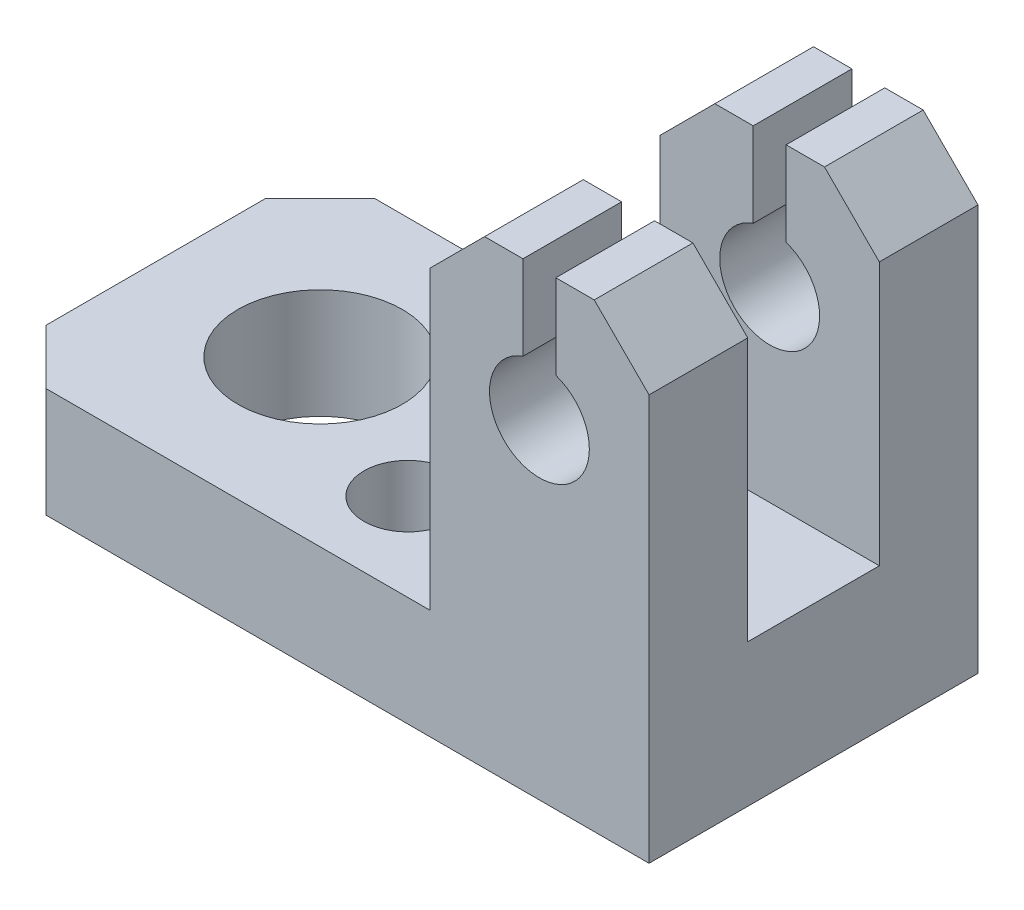
ISO-10303-21;
HEADER;
FILE_DESCRIPTION(('STEP AP214'),'2;1');
FILE_NAME('part.step','',(''),(''),'','','');
FILE_SCHEMA(('AUTOMOTIVE_DESIGN { 1 0 10303 214 1 1 1 1 }'));
ENDSEC;
DATA;
#1=APPLICATION_CONTEXT('core data for automotive mechanical design processes');
#2=APPLICATION_PROTOCOL_DEFINITION('international standard','automotive_design',2000,#1);
#3=PRODUCT_CONTEXT('',#1,'mechanical');
#4=PRODUCT('Part','Part','',(#3));
#5=PRODUCT_RELATED_PRODUCT_CATEGORY('part','',(#4));
#6=PRODUCT_DEFINITION_FORMATION('','',#4);
#7=PRODUCT_DEFINITION_CONTEXT('part definition',#1,'design');
#8=PRODUCT_DEFINITION('design','',#6,#7);
#9=PRODUCT_DEFINITION_SHAPE('','',#8);
#10=(LENGTH_UNIT() NAMED_UNIT(*) SI_UNIT(.MILLI.,.METRE.));
#11=(NAMED_UNIT(*) PLANE_ANGLE_UNIT() SI_UNIT($,.RADIAN.));
#12=(NAMED_UNIT(*) SI_UNIT($,.STERADIAN.) SOLID_ANGLE_UNIT());
#13=UNCERTAINTY_MEASURE_WITH_UNIT(LENGTH_MEASURE(1.E-05),#10,'distance_accuracy_value','');
#14=(GEOMETRIC_REPRESENTATION_CONTEXT(3) GLOBAL_UNCERTAINTY_ASSIGNED_CONTEXT((#13)) GLOBAL_UNIT_ASSIGNED_CONTEXT((#10,
#11,#12)) REPRESENTATION_CONTEXT('',''));
#15=CARTESIAN_POINT('',(0.,0.,0.));
#16=DIRECTION('',(0.,0.,1.));
#17=DIRECTION('',(1.,0.,0.));
#18=AXIS2_PLACEMENT_3D('',#15,#16,#17);
#19=CARTESIAN_POINT('',(-10.,30.,30.));
#20=DIRECTION('',(0.,0.,-1.));
#21=DIRECTION('',(-1.,0.,0.));
#22=AXIS2_PLACEMENT_3D('',#19,#20,#21);
#23=CYLINDRICAL_SURFACE('',#22,4.55349178710825);
#24=CARTESIAN_POINT('',(-10.,30.,9.));
#25=DIRECTION('',(0.,0.,-1.));
#26=DIRECTION('',(0.,1.,0.));
#27=AXIS2_PLACEMENT_3D('',#24,#25,#26);
#28=CIRCLE('',#27,4.55349178710825);
#29=CARTESIAN_POINT('',(-8.5,34.2993356992985,9.));
#30=VERTEX_POINT('',#29);
#31=CARTESIAN_POINT('',(-11.5,34.2993356992985,9.));
#32=VERTEX_POINT('',#31);
#33=EDGE_CURVE('E270',#30,#32,#28,.T.);
#34=ORIENTED_EDGE('',*,*,#33,.F.);
#35=DIRECTION('',(0.,0.,-1.));
#36=VECTOR('',#35,1.);
#37=CARTESIAN_POINT('',(-8.5,34.2993356992985,30.));
#38=LINE('',#37,#36);
#39=CARTESIAN_POINT('',(-8.5,34.2993356992985,0.));
#40=VERTEX_POINT('',#39);
#41=EDGE_CURVE('E336',#30,#40,#38,.T.);
#42=ORIENTED_EDGE('',*,*,#41,.T.);
#43=CARTESIAN_POINT('',(-10.,30.,0.));
#44=DIRECTION('',(0.,0.,1.));
#45=DIRECTION('',(1.,0.,0.));
#46=AXIS2_PLACEMENT_3D('',#43,#44,#45);
#47=CIRCLE('',#46,4.55349178710825);
#48=CARTESIAN_POINT('',(-11.5,34.2993356992985,0.));
#49=VERTEX_POINT('',#48);
#50=EDGE_CURVE('E281',#49,#40,#47,.T.);
#51=ORIENTED_EDGE('',*,*,#50,.F.);
#52=DIRECTION('',(0.,0.,-1.));
#53=VECTOR('',#52,1.);
#54=CARTESIAN_POINT('',(-11.5,34.2993356992985,30.));
#55=LINE('',#54,#53);
#56=EDGE_CURVE('E395',#32,#49,#55,.T.);
#57=ORIENTED_EDGE('',*,*,#56,.F.);
#58=EDGE_LOOP('',(#34,#42,#51,#57));
#59=FACE_BOUND('',#58,.T.);
#60=ADVANCED_FACE('F49',(#59),#23,.F.);
#61=CARTESIAN_POINT('',(-11.5,0.,30.));
#62=DIRECTION('',(1.,0.,0.));
#63=DIRECTION('',(0.,1.,0.));
#64=AXIS2_PLACEMENT_3D('',#61,#62,#63);
#65=PLANE('',#64);
#66=DIRECTION('',(0.,1.,0.));
#67=VECTOR('',#66,1.);
#68=CARTESIAN_POINT('',(-11.5,0.,9.00000000000001));
#69=LINE('',#68,#67);
#70=CARTESIAN_POINT('',(-11.5,42.,9.));
#71=VERTEX_POINT('',#70);
#72=EDGE_CURVE('E273',#32,#71,#69,.T.);
#73=ORIENTED_EDGE('',*,*,#72,.F.);
#74=ORIENTED_EDGE('',*,*,#56,.T.);
#75=DIRECTION('',(0.,-1.,0.));
#76=VECTOR('',#75,1.);
#77=CARTESIAN_POINT('',(-11.5,0.,0.));
#78=LINE('',#77,#76);
#79=CARTESIAN_POINT('',(-11.5,42.,0.));
#80=VERTEX_POINT('',#79);
#81=EDGE_CURVE('E340',#80,#49,#78,.T.);
#82=ORIENTED_EDGE('',*,*,#81,.F.);
#83=DIRECTION('',(0.,0.,-1.));
#84=VECTOR('',#83,1.);
#85=CARTESIAN_POINT('',(-11.5,42.,30.));
#86=LINE('',#85,#84);
#87=EDGE_CURVE('E390',#71,#80,#86,.T.);
#88=ORIENTED_EDGE('',*,*,#87,.F.);
#89=EDGE_LOOP('',(#73,#74,#82,#88));
#90=FACE_BOUND('',#89,.T.);
#91=ADVANCED_FACE('F567',(#90),#65,.T.);
#92=CARTESIAN_POINT('',(0.,42.,30.));
#93=DIRECTION('',(0.,-1.,0.));
#94=DIRECTION('',(0.,0.,-1.));
#95=AXIS2_PLACEMENT_3D('',#92,#93,#94);
#96=PLANE('',#95);
#97=DIRECTION('',(-1.,0.,0.));
#98=VECTOR('',#97,1.);
#99=CARTESIAN_POINT('',(0.,42.,0.));
#100=LINE('',#99,#98);
#101=CARTESIAN_POINT('',(-15.,42.,0.));
#102=VERTEX_POINT('',#101);
#103=EDGE_CURVE('E344',#80,#102,#100,.T.);
#104=ORIENTED_EDGE('',*,*,#103,.T.);
#105=DIRECTION('',(0.,0.,1.));
#106=VECTOR('',#105,1.);
#107=CARTESIAN_POINT('',(-15.,42.,9.));
#108=LINE('',#107,#106);
#109=CARTESIAN_POINT('',(-15.,42.,9.));
#110=VERTEX_POINT('',#109);
#111=EDGE_CURVE('E463',#102,#110,#108,.T.);
#112=ORIENTED_EDGE('',*,*,#111,.T.);
#113=DIRECTION('',(-1.,0.,0.));
#114=VECTOR('',#113,1.);
#115=CARTESIAN_POINT('',(0.,42.,9.));
#116=LINE('',#115,#114);
#117=EDGE_CURVE('E258',#71,#110,#116,.T.);
#118=ORIENTED_EDGE('',*,*,#117,.F.);
#119=ORIENTED_EDGE('',*,*,#87,.T.);
#120=EDGE_LOOP('',(#104,#112,#118,#119));
#121=FACE_BOUND('',#120,.T.);
#122=ADVANCED_FACE('F545',(#121),#96,.F.);
#123=CARTESIAN_POINT('',(0.,42.,30.));
#124=DIRECTION('',(0.,-1.,0.));
#125=DIRECTION('',(0.,0.,-1.));
#126=AXIS2_PLACEMENT_3D('',#123,#124,#125);
#127=PLANE('',#126);
#128=CARTESIAN_POINT('',(-5.,42.,9.));
#129=VERTEX_POINT('',#128);
#130=CARTESIAN_POINT('',(-8.5,42.,9.));
#131=VERTEX_POINT('',#130);
#132=EDGE_CURVE('E254',#129,#131,#116,.T.);
#133=ORIENTED_EDGE('',*,*,#132,.F.);
#134=DIRECTION('',(0.,0.,-1.));
#135=VECTOR('',#134,1.);
#136=CARTESIAN_POINT('',(-5.,42.,30.));
#137=LINE('',#136,#135);
#138=CARTESIAN_POINT('',(-5.,42.,0.));
#139=VERTEX_POINT('',#138);
#140=EDGE_CURVE('E408',#129,#139,#137,.T.);
#141=ORIENTED_EDGE('',*,*,#140,.T.);
#142=DIRECTION('',(-1.,0.,0.));
#143=VECTOR('',#142,1.);
#144=CARTESIAN_POINT('',(0.,42.,0.));
#145=LINE('',#144,#143);
#146=CARTESIAN_POINT('',(-8.5,42.,0.));
#147=VERTEX_POINT('',#146);
#148=EDGE_CURVE('E362',#139,#147,#145,.T.);
#149=ORIENTED_EDGE('',*,*,#148,.T.);
#150=DIRECTION('',(0.,0.,-1.));
#151=VECTOR('',#150,1.);
#152=CARTESIAN_POINT('',(-8.5,42.,30.));
#153=LINE('',#152,#151);
#154=EDGE_CURVE('E372',#131,#147,#153,.T.);
#155=ORIENTED_EDGE('',*,*,#154,.F.);
#156=EDGE_LOOP('',(#133,#141,#149,#155));
#157=FACE_BOUND('',#156,.T.);
#158=ADVANCED_FACE('F568',(#157),#127,.F.);
#159=CARTESIAN_POINT('',(-8.49999999999999,0.,30.));
#160=DIRECTION('',(1.,0.,0.));
#161=DIRECTION('',(0.,1.,0.));
#162=AXIS2_PLACEMENT_3D('',#159,#160,#161);
#163=PLANE('',#162);
#164=ORIENTED_EDGE('',*,*,#41,.F.);
#165=DIRECTION('',(0.,1.,0.));
#166=VECTOR('',#165,1.);
#167=CARTESIAN_POINT('',(-8.49999999999999,0.,9.00000000000001));
#168=LINE('',#167,#166);
#169=EDGE_CURVE('E404',#30,#131,#168,.T.);
#170=ORIENTED_EDGE('',*,*,#169,.T.);
#171=ORIENTED_EDGE('',*,*,#154,.T.);
#172=DIRECTION('',(0.,-1.,0.));
#173=VECTOR('',#172,1.);
#174=CARTESIAN_POINT('',(-8.49999999999999,0.,0.));
#175=LINE('',#174,#173);
#176=EDGE_CURVE('E306',#147,#40,#175,.T.);
#177=ORIENTED_EDGE('',*,*,#176,.T.);
#178=EDGE_LOOP('',(#164,#170,#171,#177));
#179=FACE_BOUND('',#178,.T.);
#180=ADVANCED_FACE('F560',(#179),#163,.F.);
#181=CARTESIAN_POINT('',(-10.,30.,21.));
#182=DIRECTION('',(0.,0.,1.));
#183=DIRECTION('',(0.,-1.,0.));
#184=AXIS2_PLACEMENT_3D('',#181,#182,#183);
#185=CIRCLE('',#184,4.55349178710825);
#186=CARTESIAN_POINT('',(-11.5,34.2993356992985,21.));
#187=VERTEX_POINT('',#186);
#188=CARTESIAN_POINT('',(-8.5,34.2993356992985,21.));
#189=VERTEX_POINT('',#188);
#190=EDGE_CURVE('E257',#187,#189,#185,.T.);
#191=ORIENTED_EDGE('',*,*,#190,.F.);
#192=CARTESIAN_POINT('',(-11.5,34.2993356992985,30.));
#193=VERTEX_POINT('',#192);
#194=EDGE_CURVE('E396',#193,#187,#55,.T.);
#195=ORIENTED_EDGE('',*,*,#194,.F.);
#196=CARTESIAN_POINT('',(-10.,30.,30.));
#197=DIRECTION('',(0.,0.,1.));
#198=DIRECTION('',(1.,0.,0.));
#199=AXIS2_PLACEMENT_3D('',#196,#197,#198);
#200=CIRCLE('',#199,4.55349178710825);
#201=CARTESIAN_POINT('',(-8.5,34.2993356992985,30.));
#202=VERTEX_POINT('',#201);
#203=EDGE_CURVE('E301',#193,#202,#200,.T.);
#204=ORIENTED_EDGE('',*,*,#203,.T.);
#205=EDGE_CURVE('E368',#202,#189,#38,.T.);
#206=ORIENTED_EDGE('',*,*,#205,.T.);
#207=EDGE_LOOP('',(#191,#195,#204,#206));
#208=FACE_BOUND('',#207,.T.);
#209=ADVANCED_FACE('F558',(#208),#23,.F.);
#210=DIRECTION('',(0.,-1.,0.));
#211=VECTOR('',#210,1.);
#212=CARTESIAN_POINT('',(-11.5,0.,21.));
#213=LINE('',#212,#211);
#214=CARTESIAN_POINT('',(-11.5,42.,21.));
#215=VERTEX_POINT('',#214);
#216=EDGE_CURVE('E267',#215,#187,#213,.T.);
#217=ORIENTED_EDGE('',*,*,#216,.F.);
#218=CARTESIAN_POINT('',(-11.5,42.,30.));
#219=VERTEX_POINT('',#218);
#220=EDGE_CURVE('E391',#219,#215,#86,.T.);
#221=ORIENTED_EDGE('',*,*,#220,.F.);
#222=DIRECTION('',(0.,-1.,0.));
#223=VECTOR('',#222,1.);
#224=CARTESIAN_POINT('',(-11.5,0.,30.));
#225=LINE('',#224,#223);
#226=EDGE_CURVE('E305',#219,#193,#225,.T.);
#227=ORIENTED_EDGE('',*,*,#226,.T.);
#228=ORIENTED_EDGE('',*,*,#194,.T.);
#229=EDGE_LOOP('',(#217,#221,#227,#228));
#230=FACE_BOUND('',#229,.T.);
#231=ADVANCED_FACE('F523',(#230),#65,.T.);
#232=DIRECTION('',(-1.,0.,0.));
#233=VECTOR('',#232,1.);
#234=CARTESIAN_POINT('',(0.,42.,21.));
#235=LINE('',#234,#233);
#236=CARTESIAN_POINT('',(-15.,42.,21.));
#237=VERTEX_POINT('',#236);
#238=EDGE_CURVE('E262',#215,#237,#235,.T.);
#239=ORIENTED_EDGE('',*,*,#238,.T.);
#240=DIRECTION('',(0.,0.,1.));
#241=VECTOR('',#240,1.);
#242=CARTESIAN_POINT('',(-15.,42.,30.));
#243=LINE('',#242,#241);
#244=CARTESIAN_POINT('',(-15.,42.,30.));
#245=VERTEX_POINT('',#244);
#246=EDGE_CURVE('E460',#237,#245,#243,.T.);
#247=ORIENTED_EDGE('',*,*,#246,.T.);
#248=DIRECTION('',(-1.,0.,0.));
#249=VECTOR('',#248,1.);
#250=CARTESIAN_POINT('',(0.,42.,30.));
#251=LINE('',#250,#249);
#252=EDGE_CURVE('E310',#219,#245,#251,.T.);
#253=ORIENTED_EDGE('',*,*,#252,.F.);
#254=ORIENTED_EDGE('',*,*,#220,.T.);
#255=EDGE_LOOP('',(#239,#247,#253,#254));
#256=FACE_BOUND('',#255,.T.);
#257=ADVANCED_FACE('F527',(#256),#96,.F.);
#258=CARTESIAN_POINT('',(-20.,0.,30.));
#259=DIRECTION('',(-1.,0.,0.));
#260=DIRECTION('',(0.,-1.,0.));
#261=AXIS2_PLACEMENT_3D('',#258,#259,#260);
#262=PLANE('',#261);
#263=DIRECTION('',(0.,1.,0.));
#264=VECTOR('',#263,1.);
#265=CARTESIAN_POINT('',(-20.,0.,30.));
#266=LINE('',#265,#264);
#267=CARTESIAN_POINT('',(-20.,10.,30.));
#268=VERTEX_POINT('',#267);
#269=CARTESIAN_POINT('',(-20.,37.,30.));
#270=VERTEX_POINT('',#269);
#271=EDGE_CURVE('E314',#268,#270,#266,.T.);
#272=ORIENTED_EDGE('',*,*,#271,.T.);
#273=DIRECTION('',(0.,0.,-1.));
#274=VECTOR('',#273,1.);
#275=CARTESIAN_POINT('',(-20.,37.,21.));
#276=LINE('',#275,#274);
#277=CARTESIAN_POINT('',(-20.,37.,21.));
#278=VERTEX_POINT('',#277);
#279=EDGE_CURVE('E456',#270,#278,#276,.T.);
#280=ORIENTED_EDGE('',*,*,#279,.T.);
#281=DIRECTION('',(0.,1.,0.));
#282=VECTOR('',#281,1.);
#283=CARTESIAN_POINT('',(-20.,42.,21.));
#284=LINE('',#283,#282);
#285=CARTESIAN_POINT('',(-20.,13.,21.));
#286=VERTEX_POINT('',#285);
#287=EDGE_CURVE('E225',#286,#278,#284,.T.);
#288=ORIENTED_EDGE('',*,*,#287,.F.);
#289=DIRECTION('',(0.,0.,1.));
#290=VECTOR('',#289,1.);
#291=CARTESIAN_POINT('',(-20.,13.,9.));
#292=LINE('',#291,#290);
#293=CARTESIAN_POINT('',(-20.,13.,9.));
#294=VERTEX_POINT('',#293);
#295=EDGE_CURVE('E248',#294,#286,#292,.T.);
#296=ORIENTED_EDGE('',*,*,#295,.F.);
#297=DIRECTION('',(0.,-1.,0.));
#298=VECTOR('',#297,1.);
#299=CARTESIAN_POINT('',(-20.,42.,9.));
#300=LINE('',#299,#298);
#301=CARTESIAN_POINT('',(-20.,37.,9.));
#302=VERTEX_POINT('',#301);
#303=EDGE_CURVE('E231',#302,#294,#300,.T.);
#304=ORIENTED_EDGE('',*,*,#303,.F.);
#305=DIRECTION('',(0.,0.,-1.));
#306=VECTOR('',#305,1.);
#307=CARTESIAN_POINT('',(-20.,37.,0.));
#308=LINE('',#307,#306);
#309=CARTESIAN_POINT('',(-20.,37.,0.));
#310=VERTEX_POINT('',#309);
#311=EDGE_CURVE('E452',#302,#310,#308,.T.);
#312=ORIENTED_EDGE('',*,*,#311,.T.);
#313=DIRECTION('',(0.,1.,0.));
#314=VECTOR('',#313,1.);
#315=CARTESIAN_POINT('',(-20.,0.,0.));
#316=LINE('',#315,#314);
#317=CARTESIAN_POINT('',(-20.,10.,0.));
#318=VERTEX_POINT('',#317);
#319=EDGE_CURVE('E348',#318,#310,#316,.T.);
#320=ORIENTED_EDGE('',*,*,#319,.F.);
#321=DIRECTION('',(0.,0.,-1.));
#322=VECTOR('',#321,1.);
#323=CARTESIAN_POINT('',(-20.,10.,30.));
#324=LINE('',#323,#322);
#325=EDGE_CURVE('E387',#268,#318,#324,.T.);
#326=ORIENTED_EDGE('',*,*,#325,.F.);
#327=EDGE_LOOP('',(#272,#280,#288,#296,#304,#312,#320,#326));
#328=FACE_BOUND('',#327,.T.);
#329=ADVANCED_FACE('F535',(#328),#262,.T.);
#330=CARTESIAN_POINT('',(0.,10.,30.));
#331=DIRECTION('',(0.,-1.,0.));
#332=DIRECTION('',(1.,0.,0.));
#333=AXIS2_PLACEMENT_3D('',#330,#331,#332);
#334=PLANE('',#333);
#335=CARTESIAN_POINT('',(-45.,9.99999999999999,15.));
#336=DIRECTION('',(0.,1.,0.));
#337=DIRECTION('',(-1.,0.,0.));
#338=AXIS2_PLACEMENT_3D('',#335,#336,#337);
#339=CIRCLE('',#338,7.5);
#340=CARTESIAN_POINT('',(-52.5,9.99999999999999,15.));
#341=VERTEX_POINT('',#340);
#342=EDGE_CURVE('E282',#341,#341,#339,.T.);
#343=ORIENTED_EDGE('',*,*,#342,.F.);
#344=EDGE_LOOP('',(#343));
#345=FACE_BOUND('',#344,.T.);
#346=CARTESIAN_POINT('',(-30.,9.99999999999999,8.));
#347=DIRECTION('',(0.,1.,0.));
#348=DIRECTION('',(-1.,0.,0.));
#349=AXIS2_PLACEMENT_3D('',#346,#347,#348);
#350=CIRCLE('',#349,4.);
#351=CARTESIAN_POINT('',(-34.,9.99999999999999,8.));
#352=VERTEX_POINT('',#351);
#353=EDGE_CURVE('E286',#352,#352,#350,.T.);
#354=ORIENTED_EDGE('',*,*,#353,.F.);
#355=EDGE_LOOP('',(#354));
#356=FACE_BOUND('',#355,.T.);
#357=CARTESIAN_POINT('',(-30.,9.99999999999999,22.));
#358=DIRECTION('',(0.,1.,0.));
#359=DIRECTION('',(-1.,0.,0.));
#360=AXIS2_PLACEMENT_3D('',#357,#358,#359);
#361=CIRCLE('',#360,4.);
#362=CARTESIAN_POINT('',(-34.,9.99999999999999,22.));
#363=VERTEX_POINT('',#362);
#364=EDGE_CURVE('E294',#363,#363,#361,.T.);
#365=ORIENTED_EDGE('',*,*,#364,.F.);
#366=EDGE_LOOP('',(#365));
#367=FACE_BOUND('',#366,.T.);
#368=DIRECTION('',(0.,0.,-1.));
#369=VECTOR('',#368,1.);
#370=CARTESIAN_POINT('',(-60.,9.99999999999999,30.));
#371=LINE('',#370,#369);
#372=CARTESIAN_POINT('',(-60.,9.99999999999999,25.));
#373=VERTEX_POINT('',#372);
#374=CARTESIAN_POINT('',(-60.,9.99999999999999,5.00000000000001));
#375=VERTEX_POINT('',#374);
#376=EDGE_CURVE('E384',#373,#375,#371,.T.);
#377=ORIENTED_EDGE('',*,*,#376,.F.);
#378=DIRECTION('',(-0.707106781186549,0.,-0.707106781186546));
#379=VECTOR('',#378,1.);
#380=CARTESIAN_POINT('',(-60.,9.99999999999999,25.));
#381=LINE('',#380,#379);
#382=CARTESIAN_POINT('',(-55.,9.99999999999999,30.));
#383=VERTEX_POINT('',#382);
#384=EDGE_CURVE('E74',#373,#383,#381,.F.);
#385=ORIENTED_EDGE('',*,*,#384,.T.);
#386=DIRECTION('',(-1.,0.,0.));
#387=VECTOR('',#386,1.);
#388=CARTESIAN_POINT('',(0.,10.,30.));
#389=LINE('',#388,#387);
#390=EDGE_CURVE('E318',#268,#383,#389,.T.);
#391=ORIENTED_EDGE('',*,*,#390,.F.);
#392=ORIENTED_EDGE('',*,*,#325,.T.);
#393=DIRECTION('',(-1.,0.,0.));
#394=VECTOR('',#393,1.);
#395=CARTESIAN_POINT('',(0.,10.,0.));
#396=LINE('',#395,#394);
#397=CARTESIAN_POINT('',(-55.,9.99999999999999,0.));
#398=VERTEX_POINT('',#397);
#399=EDGE_CURVE('E352',#318,#398,#396,.T.);
#400=ORIENTED_EDGE('',*,*,#399,.T.);
#401=DIRECTION('',(-0.707106781186546,0.,0.707106781186549));
#402=VECTOR('',#401,1.);
#403=CARTESIAN_POINT('',(-55.,9.99999999999999,0.));
#404=LINE('',#403,#402);
#405=EDGE_CURVE('E66',#398,#375,#404,.T.);
#406=ORIENTED_EDGE('',*,*,#405,.T.);
#407=EDGE_LOOP('',(#377,#385,#391,#392,#400,#406));
#408=FACE_BOUND('',#407,.T.);
#409=ADVANCED_FACE('F491',(#345,#356,#367,#408),#334,.F.);
#410=CARTESIAN_POINT('',(-60.,0.,30.));
#411=DIRECTION('',(-1.,0.,0.));
#412=DIRECTION('',(0.,0.,1.));
#413=AXIS2_PLACEMENT_3D('',#410,#411,#412);
#414=PLANE('',#413);
#415=DIRECTION('',(0.,0.,-1.));
#416=VECTOR('',#415,1.);
#417=CARTESIAN_POINT('',(-60.,0.,30.));
#418=LINE('',#417,#416);
#419=CARTESIAN_POINT('',(-60.,0.,25.));
#420=VERTEX_POINT('',#419);
#421=CARTESIAN_POINT('',(-60.,0.,5.00000000000001));
#422=VERTEX_POINT('',#421);
#423=EDGE_CURVE('E380',#420,#422,#418,.T.);
#424=ORIENTED_EDGE('',*,*,#423,.F.);
#425=DIRECTION('',(0.,1.,0.));
#426=VECTOR('',#425,1.);
#427=CARTESIAN_POINT('',(-60.,0.,25.));
#428=LINE('',#427,#426);
#429=EDGE_CURVE('E469',#420,#373,#428,.T.);
#430=ORIENTED_EDGE('',*,*,#429,.T.);
#431=ORIENTED_EDGE('',*,*,#376,.T.);
#432=DIRECTION('',(0.,-1.,0.));
#433=VECTOR('',#432,1.);
#434=CARTESIAN_POINT('',(-60.,0.,5.00000000000001));
#435=LINE('',#434,#433);
#436=EDGE_CURVE('E466',#375,#422,#435,.T.);
#437=ORIENTED_EDGE('',*,*,#436,.T.);
#438=EDGE_LOOP('',(#424,#430,#431,#437));
#439=FACE_BOUND('',#438,.T.);
#440=ADVANCED_FACE('F490',(#439),#414,.T.);
#441=CARTESIAN_POINT('',(0.,0.,30.));
#442=DIRECTION('',(0.,-1.,0.));
#443=DIRECTION('',(0.,0.,-1.));
#444=AXIS2_PLACEMENT_3D('',#441,#442,#443);
#445=PLANE('',#444);
#446=CARTESIAN_POINT('',(-45.,0.,15.));
#447=DIRECTION('',(0.,1.,0.));
#448=DIRECTION('',(-1.,0.,0.));
#449=AXIS2_PLACEMENT_3D('',#446,#447,#448);
#450=CIRCLE('',#449,7.5);
#451=CARTESIAN_POINT('',(-52.5,0.,15.));
#452=VERTEX_POINT('',#451);
#453=EDGE_CURVE('E277',#452,#452,#450,.T.);
#454=ORIENTED_EDGE('',*,*,#453,.T.);
#455=EDGE_LOOP('',(#454));
#456=FACE_BOUND('',#455,.T.);
#457=CARTESIAN_POINT('',(-30.,0.,8.));
#458=DIRECTION('',(0.,1.,0.));
#459=DIRECTION('',(-1.,0.,0.));
#460=AXIS2_PLACEMENT_3D('',#457,#458,#459);
#461=CIRCLE('',#460,4.);
#462=CARTESIAN_POINT('',(-34.,0.,8.));
#463=VERTEX_POINT('',#462);
#464=EDGE_CURVE('E290',#463,#463,#461,.T.);
#465=ORIENTED_EDGE('',*,*,#464,.T.);
#466=EDGE_LOOP('',(#465));
#467=FACE_BOUND('',#466,.T.);
#468=CARTESIAN_POINT('',(-30.,0.,22.));
#469=DIRECTION('',(0.,1.,0.));
#470=DIRECTION('',(-1.,0.,0.));
#471=AXIS2_PLACEMENT_3D('',#468,#469,#470);
#472=CIRCLE('',#471,4.);
#473=CARTESIAN_POINT('',(-34.,0.,22.));
#474=VERTEX_POINT('',#473);
#475=EDGE_CURVE('E276',#474,#474,#472,.T.);
#476=ORIENTED_EDGE('',*,*,#475,.T.);
#477=EDGE_LOOP('',(#476));
#478=FACE_BOUND('',#477,.T.);
#479=DIRECTION('',(-1.,0.,0.));
#480=VECTOR('',#479,1.);
#481=CARTESIAN_POINT('',(0.,0.,30.));
#482=LINE('',#481,#480);
#483=CARTESIAN_POINT('',(0.,0.,30.));
#484=VERTEX_POINT('',#483);
#485=CARTESIAN_POINT('',(-55.,0.,30.));
#486=VERTEX_POINT('',#485);
#487=EDGE_CURVE('E322',#484,#486,#482,.T.);
#488=ORIENTED_EDGE('',*,*,#487,.T.);
#489=DIRECTION('',(0.707106781186549,0.,0.707106781186546));
#490=VECTOR('',#489,1.);
#491=CARTESIAN_POINT('',(-27.4999999999999,0.,57.5));
#492=LINE('',#491,#490);
#493=EDGE_CURVE('E11',#486,#420,#492,.F.);
#494=ORIENTED_EDGE('',*,*,#493,.T.);
#495=ORIENTED_EDGE('',*,*,#423,.T.);
#496=DIRECTION('',(0.707106781186546,0.,-0.707106781186549));
#497=VECTOR('',#496,1.);
#498=CARTESIAN_POINT('',(-42.5000000000001,0.,-12.4999999999999));
#499=LINE('',#498,#497);
#500=CARTESIAN_POINT('',(-55.,0.,0.));
#501=VERTEX_POINT('',#500);
#502=EDGE_CURVE('E59',#422,#501,#499,.T.);
#503=ORIENTED_EDGE('',*,*,#502,.T.);
#504=DIRECTION('',(-1.,0.,0.));
#505=VECTOR('',#504,1.);
#506=CARTESIAN_POINT('',(0.,0.,0.));
#507=LINE('',#506,#505);
#508=CARTESIAN_POINT('',(0.,0.,0.));
#509=VERTEX_POINT('',#508);
#510=EDGE_CURVE('E355',#509,#501,#507,.T.);
#511=ORIENTED_EDGE('',*,*,#510,.F.);
#512=DIRECTION('',(0.,0.,-1.));
#513=VECTOR('',#512,1.);
#514=CARTESIAN_POINT('',(0.,0.,30.));
#515=LINE('',#514,#513);
#516=EDGE_CURVE('E377',#484,#509,#515,.T.);
#517=ORIENTED_EDGE('',*,*,#516,.F.);
#518=EDGE_LOOP('',(#488,#494,#495,#503,#511,#517));
#519=FACE_BOUND('',#518,.T.);
#520=ADVANCED_FACE('F479',(#456,#467,#478,#519),#445,.T.);
#521=CARTESIAN_POINT('',(0.,0.,30.));
#522=DIRECTION('',(-1.,0.,0.));
#523=DIRECTION('',(0.,0.,1.));
#524=AXIS2_PLACEMENT_3D('',#521,#522,#523);
#525=PLANE('',#524);
#526=DIRECTION('',(0.,1.,0.));
#527=VECTOR('',#526,1.);
#528=CARTESIAN_POINT('',(0.,0.,0.));
#529=LINE('',#528,#527);
#530=CARTESIAN_POINT('',(0.,37.,0.));
#531=VERTEX_POINT('',#530);
#532=EDGE_CURVE('E359',#509,#531,#529,.T.);
#533=ORIENTED_EDGE('',*,*,#532,.T.);
#534=DIRECTION('',(0.,0.,1.));
#535=VECTOR('',#534,1.);
#536=CARTESIAN_POINT('',(0.,37.,30.));
#537=LINE('',#536,#535);
#538=CARTESIAN_POINT('',(0.,37.,9.));
#539=VERTEX_POINT('',#538);
#540=EDGE_CURVE('E221',#531,#539,#537,.T.);
#541=ORIENTED_EDGE('',*,*,#540,.T.);
#542=DIRECTION('',(0.,-1.,0.));
#543=VECTOR('',#542,1.);
#544=CARTESIAN_POINT('',(0.,42.,9.));
#545=LINE('',#544,#543);
#546=CARTESIAN_POINT('',(0.,13.,9.));
#547=VERTEX_POINT('',#546);
#548=EDGE_CURVE('E213',#539,#547,#545,.T.);
#549=ORIENTED_EDGE('',*,*,#548,.T.);
#550=DIRECTION('',(0.,0.,1.));
#551=VECTOR('',#550,1.);
#552=CARTESIAN_POINT('',(0.,13.,9.));
#553=LINE('',#552,#551);
#554=CARTESIAN_POINT('',(0.,13.,21.));
#555=VERTEX_POINT('',#554);
#556=EDGE_CURVE('E219',#547,#555,#553,.T.);
#557=ORIENTED_EDGE('',*,*,#556,.T.);
#558=DIRECTION('',(0.,1.,0.));
#559=VECTOR('',#558,1.);
#560=CARTESIAN_POINT('',(0.,42.,21.));
#561=LINE('',#560,#559);
#562=CARTESIAN_POINT('',(0.,37.,21.));
#563=VERTEX_POINT('',#562);
#564=EDGE_CURVE('E237',#555,#563,#561,.T.);
#565=ORIENTED_EDGE('',*,*,#564,.T.);
#566=DIRECTION('',(0.,0.,1.));
#567=VECTOR('',#566,1.);
#568=CARTESIAN_POINT('',(0.,37.,30.));
#569=LINE('',#568,#567);
#570=CARTESIAN_POINT('',(0.,37.,30.));
#571=VERTEX_POINT('',#570);
#572=EDGE_CURVE('E422',#563,#571,#569,.T.);
#573=ORIENTED_EDGE('',*,*,#572,.T.);
#574=DIRECTION('',(0.,1.,0.));
#575=VECTOR('',#574,1.);
#576=CARTESIAN_POINT('',(0.,0.,30.));
#577=LINE('',#576,#575);
#578=EDGE_CURVE('E326',#484,#571,#577,.T.);
#579=ORIENTED_EDGE('',*,*,#578,.F.);
#580=ORIENTED_EDGE('',*,*,#516,.T.);
#581=EDGE_LOOP('',(#533,#541,#549,#557,#565,#573,#579,#580));
#582=FACE_BOUND('',#581,.T.);
#583=ADVANCED_FACE('F216',(#582),#525,.F.);
#584=DIRECTION('',(-1.,0.,0.));
#585=VECTOR('',#584,1.);
#586=CARTESIAN_POINT('',(0.,42.,30.));
#587=LINE('',#586,#585);
#588=CARTESIAN_POINT('',(-5.,42.,30.));
#589=VERTEX_POINT('',#588);
#590=CARTESIAN_POINT('',(-8.5,42.,30.));
#591=VERTEX_POINT('',#590);
#592=EDGE_CURVE('E330',#589,#591,#587,.T.);
#593=ORIENTED_EDGE('',*,*,#592,.F.);
#594=DIRECTION('',(0.,0.,-1.));
#595=VECTOR('',#594,1.);
#596=CARTESIAN_POINT('',(-5.,42.,30.));
#597=LINE('',#596,#595);
#598=CARTESIAN_POINT('',(-5.,42.,21.));
#599=VERTEX_POINT('',#598);
#600=EDGE_CURVE('E433',#589,#599,#597,.T.);
#601=ORIENTED_EDGE('',*,*,#600,.T.);
#602=CARTESIAN_POINT('',(-8.5,42.,21.));
#603=VERTEX_POINT('',#602);
#604=EDGE_CURVE('E259',#599,#603,#235,.T.);
#605=ORIENTED_EDGE('',*,*,#604,.T.);
#606=EDGE_CURVE('E373',#591,#603,#153,.T.);
#607=ORIENTED_EDGE('',*,*,#606,.F.);
#608=EDGE_LOOP('',(#593,#601,#605,#607));
#609=FACE_BOUND('',#608,.T.);
#610=ADVANCED_FACE('F508',(#609),#127,.F.);
#611=ORIENTED_EDGE('',*,*,#606,.T.);
#612=DIRECTION('',(0.,-1.,0.));
#613=VECTOR('',#612,1.);
#614=CARTESIAN_POINT('',(-8.49999999999999,0.,21.));
#615=LINE('',#614,#613);
#616=EDGE_CURVE('E400',#603,#189,#615,.T.);
#617=ORIENTED_EDGE('',*,*,#616,.T.);
#618=ORIENTED_EDGE('',*,*,#205,.F.);
#619=DIRECTION('',(0.,-1.,0.));
#620=VECTOR('',#619,1.);
#621=CARTESIAN_POINT('',(-8.49999999999999,0.,30.));
#622=LINE('',#621,#620);
#623=EDGE_CURVE('E333',#591,#202,#622,.T.);
#624=ORIENTED_EDGE('',*,*,#623,.F.);
#625=EDGE_LOOP('',(#611,#617,#618,#624));
#626=FACE_BOUND('',#625,.T.);
#627=ADVANCED_FACE('F517',(#626),#163,.F.);
#628=CARTESIAN_POINT('',(0.,0.,30.));
#629=DIRECTION('',(0.,0.,1.));
#630=DIRECTION('',(1.,0.,0.));
#631=AXIS2_PLACEMENT_3D('',#628,#629,#630);
#632=PLANE('',#631);
#633=ORIENTED_EDGE('',*,*,#578,.T.);
#634=DIRECTION('',(0.707106781186546,-0.707106781186549,0.));
#635=VECTOR('',#634,1.);
#636=CARTESIAN_POINT('',(18.5,18.4999999999999,30.));
#637=LINE('',#636,#635);
#638=EDGE_CURVE('E449',#571,#589,#637,.F.);
#639=ORIENTED_EDGE('',*,*,#638,.T.);
#640=ORIENTED_EDGE('',*,*,#592,.T.);
#641=ORIENTED_EDGE('',*,*,#623,.T.);
#642=ORIENTED_EDGE('',*,*,#203,.F.);
#643=ORIENTED_EDGE('',*,*,#226,.F.);
#644=ORIENTED_EDGE('',*,*,#252,.T.);
#645=DIRECTION('',(-0.707106781186549,-0.707106781186546,0.));
#646=VECTOR('',#645,1.);
#647=CARTESIAN_POINT('',(-28.5,28.5000000000001,30.));
#648=LINE('',#647,#646);
#649=EDGE_CURVE('E446',#245,#270,#648,.T.);
#650=ORIENTED_EDGE('',*,*,#649,.T.);
#651=ORIENTED_EDGE('',*,*,#271,.F.);
#652=ORIENTED_EDGE('',*,*,#390,.T.);
#653=DIRECTION('',(0.,-1.,0.));
#654=VECTOR('',#653,1.);
#655=CARTESIAN_POINT('',(-55.,0.,30.));
#656=LINE('',#655,#654);
#657=EDGE_CURVE('E443',#383,#486,#656,.T.);
#658=ORIENTED_EDGE('',*,*,#657,.T.);
#659=ORIENTED_EDGE('',*,*,#487,.F.);
#660=EDGE_LOOP('',(#633,#639,#640,#641,#642,#643,#644,#650,#651,#652,#658,#659));
#661=FACE_BOUND('',#660,.T.);
#662=ADVANCED_FACE('F495',(#661),#632,.T.);
#663=CARTESIAN_POINT('',(0.,0.,0.));
#664=DIRECTION('',(0.,0.,1.));
#665=DIRECTION('',(1.,0.,0.));
#666=AXIS2_PLACEMENT_3D('',#663,#664,#665);
#667=PLANE('',#666);
#668=ORIENTED_EDGE('',*,*,#148,.F.);
#669=DIRECTION('',(-0.707106781186546,0.707106781186549,0.));
#670=VECTOR('',#669,1.);
#671=CARTESIAN_POINT('',(-5.,42.,0.));
#672=LINE('',#671,#670);
#673=EDGE_CURVE('E419',#139,#531,#672,.F.);
#674=ORIENTED_EDGE('',*,*,#673,.T.);
#675=ORIENTED_EDGE('',*,*,#532,.F.);
#676=ORIENTED_EDGE('',*,*,#510,.T.);
#677=DIRECTION('',(0.,1.,0.));
#678=VECTOR('',#677,1.);
#679=CARTESIAN_POINT('',(-55.,9.99999999999999,0.));
#680=LINE('',#679,#678);
#681=EDGE_CURVE('E412',#501,#398,#680,.T.);
#682=ORIENTED_EDGE('',*,*,#681,.T.);
#683=ORIENTED_EDGE('',*,*,#399,.F.);
#684=ORIENTED_EDGE('',*,*,#319,.T.);
#685=DIRECTION('',(0.707106781186549,0.707106781186546,0.));
#686=VECTOR('',#685,1.);
#687=CARTESIAN_POINT('',(-20.,37.,0.));
#688=LINE('',#687,#686);
#689=EDGE_CURVE('E416',#310,#102,#688,.T.);
#690=ORIENTED_EDGE('',*,*,#689,.T.);
#691=ORIENTED_EDGE('',*,*,#103,.F.);
#692=ORIENTED_EDGE('',*,*,#81,.T.);
#693=ORIENTED_EDGE('',*,*,#50,.T.);
#694=ORIENTED_EDGE('',*,*,#176,.F.);
#695=EDGE_LOOP('',(#668,#674,#675,#676,#682,#683,#684,#690,#691,#692,#693,#694));
#696=FACE_BOUND('',#695,.T.);
#697=ADVANCED_FACE('F487',(#696),#667,.F.);
#698=CARTESIAN_POINT('',(-30.,0.,22.));
#699=DIRECTION('',(0.,1.,0.));
#700=DIRECTION('',(-1.,0.,0.));
#701=AXIS2_PLACEMENT_3D('',#698,#699,#700);
#702=CYLINDRICAL_SURFACE('',#701,4.);
#703=ORIENTED_EDGE('',*,*,#475,.F.);
#704=EDGE_LOOP('',(#703));
#705=FACE_BOUND('',#704,.T.);
#706=ORIENTED_EDGE('',*,*,#364,.T.);
#707=EDGE_LOOP('',(#706));
#708=FACE_BOUND('',#707,.T.);
#709=ADVANCED_FACE('F719',(#705,#708),#702,.F.);
#710=CARTESIAN_POINT('',(-30.,0.,8.));
#711=DIRECTION('',(0.,1.,0.));
#712=DIRECTION('',(-1.,0.,0.));
#713=AXIS2_PLACEMENT_3D('',#710,#711,#712);
#714=CYLINDRICAL_SURFACE('',#713,4.);
#715=ORIENTED_EDGE('',*,*,#464,.F.);
#716=EDGE_LOOP('',(#715));
#717=FACE_BOUND('',#716,.T.);
#718=ORIENTED_EDGE('',*,*,#353,.T.);
#719=EDGE_LOOP('',(#718));
#720=FACE_BOUND('',#719,.T.);
#721=ADVANCED_FACE('F709',(#717,#720),#714,.F.);
#722=CARTESIAN_POINT('',(-45.,0.,15.));
#723=DIRECTION('',(0.,1.,0.));
#724=DIRECTION('',(-1.,0.,0.));
#725=AXIS2_PLACEMENT_3D('',#722,#723,#724);
#726=CYLINDRICAL_SURFACE('',#725,7.5);
#727=ORIENTED_EDGE('',*,*,#453,.F.);
#728=EDGE_LOOP('',(#727));
#729=FACE_BOUND('',#728,.T.);
#730=ORIENTED_EDGE('',*,*,#342,.T.);
#731=EDGE_LOOP('',(#730));
#732=FACE_BOUND('',#731,.T.);
#733=ADVANCED_FACE('F673',(#729,#732),#726,.F.);
#734=CARTESIAN_POINT('',(0.,42.,9.));
#735=DIRECTION('',(0.,0.,-1.));
#736=DIRECTION('',(0.,1.,0.));
#737=AXIS2_PLACEMENT_3D('',#734,#735,#736);
#738=PLANE('',#737);
#739=ORIENTED_EDGE('',*,*,#548,.F.);
#740=DIRECTION('',(0.707106781186546,-0.707106781186549,0.));
#741=VECTOR('',#740,1.);
#742=CARTESIAN_POINT('',(-5.,42.,9.));
#743=LINE('',#742,#741);
#744=EDGE_CURVE('E430',#539,#129,#743,.F.);
#745=ORIENTED_EDGE('',*,*,#744,.T.);
#746=ORIENTED_EDGE('',*,*,#132,.T.);
#747=ORIENTED_EDGE('',*,*,#169,.F.);
#748=ORIENTED_EDGE('',*,*,#33,.T.);
#749=ORIENTED_EDGE('',*,*,#72,.T.);
#750=ORIENTED_EDGE('',*,*,#117,.T.);
#751=DIRECTION('',(-0.707106781186549,-0.707106781186546,0.));
#752=VECTOR('',#751,1.);
#753=CARTESIAN_POINT('',(-20.,37.,9.));
#754=LINE('',#753,#752);
#755=EDGE_CURVE('E427',#110,#302,#754,.T.);
#756=ORIENTED_EDGE('',*,*,#755,.T.);
#757=ORIENTED_EDGE('',*,*,#303,.T.);
#758=DIRECTION('',(-1.,0.,0.));
#759=VECTOR('',#758,1.);
#760=CARTESIAN_POINT('',(0.,13.,9.));
#761=LINE('',#760,#759);
#762=EDGE_CURVE('E228',#547,#294,#761,.T.);
#763=ORIENTED_EDGE('',*,*,#762,.F.);
#764=EDGE_LOOP('',(#739,#745,#746,#747,#748,#749,#750,#756,#757,#763));
#765=FACE_BOUND('',#764,.T.);
#766=ADVANCED_FACE('F229',(#765),#738,.F.);
#767=CARTESIAN_POINT('',(0.,42.,21.));
#768=DIRECTION('',(0.,0.,1.));
#769=DIRECTION('',(0.,-1.,0.));
#770=AXIS2_PLACEMENT_3D('',#767,#768,#769);
#771=PLANE('',#770);
#772=ORIENTED_EDGE('',*,*,#604,.F.);
#773=DIRECTION('',(-0.707106781186546,0.707106781186549,0.));
#774=VECTOR('',#773,1.);
#775=CARTESIAN_POINT('',(-5.,42.,21.));
#776=LINE('',#775,#774);
#777=EDGE_CURVE('E440',#599,#563,#776,.F.);
#778=ORIENTED_EDGE('',*,*,#777,.T.);
#779=ORIENTED_EDGE('',*,*,#564,.F.);
#780=DIRECTION('',(-1.,0.,0.));
#781=VECTOR('',#780,1.);
#782=CARTESIAN_POINT('',(0.,13.,21.));
#783=LINE('',#782,#781);
#784=EDGE_CURVE('E236',#555,#286,#783,.T.);
#785=ORIENTED_EDGE('',*,*,#784,.T.);
#786=ORIENTED_EDGE('',*,*,#287,.T.);
#787=DIRECTION('',(0.707106781186549,0.707106781186546,0.));
#788=VECTOR('',#787,1.);
#789=CARTESIAN_POINT('',(-20.,37.,21.));
#790=LINE('',#789,#788);
#791=EDGE_CURVE('E437',#278,#237,#790,.T.);
#792=ORIENTED_EDGE('',*,*,#791,.T.);
#793=ORIENTED_EDGE('',*,*,#238,.F.);
#794=ORIENTED_EDGE('',*,*,#216,.T.);
#795=ORIENTED_EDGE('',*,*,#190,.T.);
#796=ORIENTED_EDGE('',*,*,#616,.F.);
#797=EDGE_LOOP('',(#772,#778,#779,#785,#786,#792,#793,#794,#795,#796));
#798=FACE_BOUND('',#797,.T.);
#799=ADVANCED_FACE('F512',(#798),#771,.F.);
#800=CARTESIAN_POINT('',(0.,13.,9.));
#801=DIRECTION('',(0.,-1.,0.));
#802=DIRECTION('',(0.,0.,-1.));
#803=AXIS2_PLACEMENT_3D('',#800,#801,#802);
#804=PLANE('',#803);
#805=ORIENTED_EDGE('',*,*,#295,.T.);
#806=ORIENTED_EDGE('',*,*,#784,.F.);
#807=ORIENTED_EDGE('',*,*,#556,.F.);
#808=ORIENTED_EDGE('',*,*,#762,.T.);
#809=EDGE_LOOP('',(#805,#806,#807,#808));
#810=FACE_BOUND('',#809,.T.);
#811=ADVANCED_FACE('F239',(#810),#804,.F.);
#812=CARTESIAN_POINT('',(-5.,42.,30.));
#813=DIRECTION('',(-0.707106781186549,-0.707106781186546,0.));
#814=DIRECTION('',(0.,0.,-1.));
#815=AXIS2_PLACEMENT_3D('',#812,#813,#814);
#816=PLANE('',#815);
#817=ORIENTED_EDGE('',*,*,#744,.F.);
#818=ORIENTED_EDGE('',*,*,#540,.F.);
#819=ORIENTED_EDGE('',*,*,#673,.F.);
#820=ORIENTED_EDGE('',*,*,#140,.F.);
#821=EDGE_LOOP('',(#817,#818,#819,#820));
#822=FACE_BOUND('',#821,.T.);
#823=ADVANCED_FACE('F588',(#822),#816,.F.);
#824=CARTESIAN_POINT('',(-5.,42.,30.));
#825=DIRECTION('',(-0.707106781186549,-0.707106781186546,0.));
#826=DIRECTION('',(0.,0.,-1.));
#827=AXIS2_PLACEMENT_3D('',#824,#825,#826);
#828=PLANE('',#827);
#829=ORIENTED_EDGE('',*,*,#638,.F.);
#830=ORIENTED_EDGE('',*,*,#572,.F.);
#831=ORIENTED_EDGE('',*,*,#777,.F.);
#832=ORIENTED_EDGE('',*,*,#600,.F.);
#833=EDGE_LOOP('',(#829,#830,#831,#832));
#834=FACE_BOUND('',#833,.T.);
#835=ADVANCED_FACE('F505',(#834),#828,.F.);
#836=CARTESIAN_POINT('',(-20.,37.,30.));
#837=DIRECTION('',(-0.707106781186546,0.707106781186549,0.));
#838=DIRECTION('',(0.,0.,1.));
#839=AXIS2_PLACEMENT_3D('',#836,#837,#838);
#840=PLANE('',#839);
#841=ORIENTED_EDGE('',*,*,#649,.F.);
#842=ORIENTED_EDGE('',*,*,#246,.F.);
#843=ORIENTED_EDGE('',*,*,#791,.F.);
#844=ORIENTED_EDGE('',*,*,#279,.F.);
#845=EDGE_LOOP('',(#841,#842,#843,#844));
#846=FACE_BOUND('',#845,.T.);
#847=ADVANCED_FACE('F532',(#846),#840,.T.);
#848=CARTESIAN_POINT('',(-20.,37.,30.));
#849=DIRECTION('',(-0.707106781186546,0.707106781186549,0.));
#850=DIRECTION('',(0.,0.,1.));
#851=AXIS2_PLACEMENT_3D('',#848,#849,#850);
#852=PLANE('',#851);
#853=ORIENTED_EDGE('',*,*,#755,.F.);
#854=ORIENTED_EDGE('',*,*,#111,.F.);
#855=ORIENTED_EDGE('',*,*,#689,.F.);
#856=ORIENTED_EDGE('',*,*,#311,.F.);
#857=EDGE_LOOP('',(#853,#854,#855,#856));
#858=FACE_BOUND('',#857,.T.);
#859=ADVANCED_FACE('F540',(#858),#852,.T.);
#860=CARTESIAN_POINT('',(-60.,0.,25.));
#861=DIRECTION('',(0.707106781186546,0.,-0.707106781186549));
#862=DIRECTION('',(0.,1.,0.));
#863=AXIS2_PLACEMENT_3D('',#860,#861,#862);
#864=PLANE('',#863);
#865=ORIENTED_EDGE('',*,*,#493,.F.);
#866=ORIENTED_EDGE('',*,*,#657,.F.);
#867=ORIENTED_EDGE('',*,*,#384,.F.);
#868=ORIENTED_EDGE('',*,*,#429,.F.);
#869=EDGE_LOOP('',(#865,#866,#867,#868));
#870=FACE_BOUND('',#869,.T.);
#871=ADVANCED_FACE('F498',(#870),#864,.F.);
#872=CARTESIAN_POINT('',(-55.,0.,0.));
#873=DIRECTION('',(-0.707106781186549,0.,-0.707106781186546));
#874=DIRECTION('',(0.,-1.,0.));
#875=AXIS2_PLACEMENT_3D('',#872,#873,#874);
#876=PLANE('',#875);
#877=ORIENTED_EDGE('',*,*,#502,.F.);
#878=ORIENTED_EDGE('',*,*,#436,.F.);
#879=ORIENTED_EDGE('',*,*,#405,.F.);
#880=ORIENTED_EDGE('',*,*,#681,.F.);
#881=EDGE_LOOP('',(#877,#878,#879,#880));
#882=FACE_BOUND('',#881,.T.);
#883=ADVANCED_FACE('F52',(#882),#876,.T.);
#884=CLOSED_SHELL('',(#60,#91,#122,#158,#180,#209,#231,#257,#329,#409,#440,#520,#583,#610,#627,
#662,#697,#709,#721,#733,#766,#799,#811,#823,#835,#847,#859,#871,#883));
#885=MANIFOLD_SOLID_BREP('B2',#884);
#886=ADVANCED_BREP_SHAPE_REPRESENTATION('',(#18,#885),#14);
#887=SHAPE_DEFINITION_REPRESENTATION(#9,#886);
ENDSEC;
END-ISO-10303-21;
